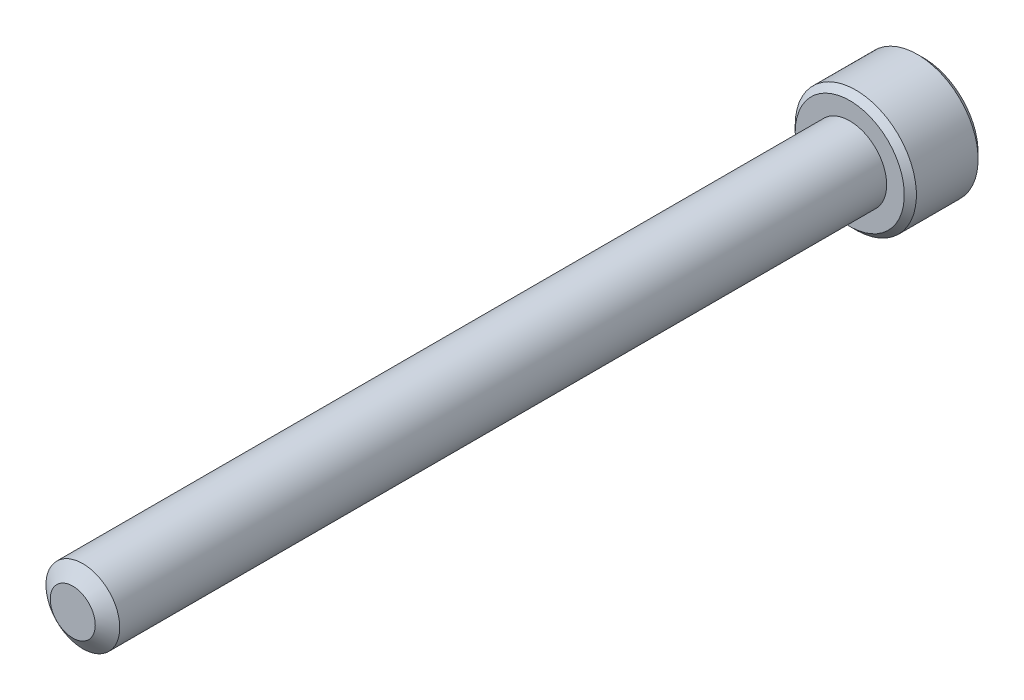
ISO-10303-21;
HEADER;
FILE_DESCRIPTION(('STEP AP214'),'2;1');
FILE_NAME('part.step','',(''),(''),'','','');
FILE_SCHEMA(('AUTOMOTIVE_DESIGN { 1 0 10303 214 1 1 1 1 }'));
ENDSEC;
DATA;
#1=APPLICATION_CONTEXT('core data for automotive mechanical design processes');
#2=APPLICATION_PROTOCOL_DEFINITION('international standard','automotive_design',2000,#1);
#3=PRODUCT_CONTEXT('',#1,'mechanical');
#4=PRODUCT('Part','Part','',(#3));
#5=PRODUCT_RELATED_PRODUCT_CATEGORY('part','',(#4));
#6=PRODUCT_DEFINITION_FORMATION('','',#4);
#7=PRODUCT_DEFINITION_CONTEXT('part definition',#1,'design');
#8=PRODUCT_DEFINITION('design','',#6,#7);
#9=PRODUCT_DEFINITION_SHAPE('','',#8);
#10=(LENGTH_UNIT() NAMED_UNIT(*) SI_UNIT(.MILLI.,.METRE.));
#11=(NAMED_UNIT(*) PLANE_ANGLE_UNIT() SI_UNIT($,.RADIAN.));
#12=(NAMED_UNIT(*) SI_UNIT($,.STERADIAN.) SOLID_ANGLE_UNIT());
#13=UNCERTAINTY_MEASURE_WITH_UNIT(LENGTH_MEASURE(1.E-05),#10,'distance_accuracy_value','');
#14=(GEOMETRIC_REPRESENTATION_CONTEXT(3) GLOBAL_UNCERTAINTY_ASSIGNED_CONTEXT((#13)) GLOBAL_UNIT_ASSIGNED_CONTEXT((#10,
#11,#12)) REPRESENTATION_CONTEXT('',''));
#15=CARTESIAN_POINT('',(0.,0.,0.));
#16=DIRECTION('',(0.,0.,1.));
#17=DIRECTION('',(1.,0.,0.));
#18=AXIS2_PLACEMENT_3D('',#15,#16,#17);
#19=CARTESIAN_POINT('',(0.,0.,-50.8));
#20=DIRECTION('',(0.,0.,1.));
#21=DIRECTION('',(1.,0.,0.));
#22=AXIS2_PLACEMENT_3D('',#19,#20,#21);
#23=CYLINDRICAL_SURFACE('',#22,2.413);
#24=CARTESIAN_POINT('',(0.,0.,-50.8));
#25=DIRECTION('',(0.,0.,-1.));
#26=DIRECTION('',(-1.,0.,0.));
#27=AXIS2_PLACEMENT_3D('',#24,#25,#26);
#28=CIRCLE('',#27,2.413);
#29=CARTESIAN_POINT('',(-2.413,0.,-50.8));
#30=VERTEX_POINT('',#29);
#31=EDGE_CURVE('E216',#30,#30,#28,.F.);
#32=ORIENTED_EDGE('',*,*,#31,.T.);
#33=EDGE_LOOP('',(#32));
#34=FACE_BOUND('',#33,.T.);
#35=CARTESIAN_POINT('',(0.,0.,-0.659180743038974));
#36=DIRECTION('',(0.,0.,1.));
#37=DIRECTION('',(1.,0.,0.));
#38=AXIS2_PLACEMENT_3D('',#35,#36,#37);
#39=CIRCLE('',#38,2.413);
#40=CARTESIAN_POINT('',(2.413,0.,-0.659180743038974));
#41=VERTEX_POINT('',#40);
#42=EDGE_CURVE('E110',#41,#41,#39,.T.);
#43=ORIENTED_EDGE('',*,*,#42,.F.);
#44=EDGE_LOOP('',(#43));
#45=FACE_BOUND('',#44,.T.);
#46=ADVANCED_FACE('F36',(#34,#45),#23,.T.);
#47=CARTESIAN_POINT('',(0.,0.,0.));
#48=DIRECTION('',(0.,0.,-1.));
#49=DIRECTION('',(-1.,0.,0.));
#50=AXIS2_PLACEMENT_3D('',#47,#48,#49);
#51=CONICAL_SURFACE('',#50,1.4715923357461,0.959931088596884);
#52=ORIENTED_EDGE('',*,*,#42,.T.);
#53=EDGE_LOOP('',(#52));
#54=FACE_BOUND('',#53,.T.);
#55=CARTESIAN_POINT('',(0.,0.,0.));
#56=DIRECTION('',(0.,0.,1.));
#57=DIRECTION('',(1.,0.,0.));
#58=AXIS2_PLACEMENT_3D('',#55,#56,#57);
#59=CIRCLE('',#58,1.4715923357461);
#60=CARTESIAN_POINT('',(1.4715923357461,0.,0.));
#61=VERTEX_POINT('',#60);
#62=EDGE_CURVE('E214',#61,#61,#59,.T.);
#63=ORIENTED_EDGE('',*,*,#62,.F.);
#64=EDGE_LOOP('',(#63));
#65=FACE_BOUND('',#64,.T.);
#66=ADVANCED_FACE('F197',(#54,#65),#51,.T.);
#67=CARTESIAN_POINT('',(0.,0.,0.));
#68=DIRECTION('',(0.,0.,1.));
#69=DIRECTION('',(1.,0.,0.));
#70=AXIS2_PLACEMENT_3D('',#67,#68,#69);
#71=PLANE('',#70);
#72=ORIENTED_EDGE('',*,*,#62,.T.);
#73=EDGE_LOOP('',(#72));
#74=FACE_BOUND('',#73,.T.);
#75=ADVANCED_FACE('F194',(#74),#71,.T.);
#76=CARTESIAN_POINT('',(0.,0.,-55.626));
#77=DIRECTION('',(0.,0.,1.));
#78=DIRECTION('',(1.,0.,0.));
#79=AXIS2_PLACEMENT_3D('',#76,#77,#78);
#80=CYLINDRICAL_SURFACE('',#79,3.9624);
#81=CARTESIAN_POINT('',(0.,0.,-55.22976));
#82=DIRECTION('',(0.,0.,-1.));
#83=DIRECTION('',(-1.,0.,0.));
#84=AXIS2_PLACEMENT_3D('',#81,#82,#83);
#85=CIRCLE('',#84,3.9624);
#86=CARTESIAN_POINT('',(-3.9624,0.,-55.22976));
#87=VERTEX_POINT('',#86);
#88=EDGE_CURVE('E44',#87,#87,#85,.F.);
#89=ORIENTED_EDGE('',*,*,#88,.T.);
#90=EDGE_LOOP('',(#89));
#91=FACE_BOUND('',#90,.T.);
#92=CARTESIAN_POINT('',(0.,0.,-51.19624));
#93=DIRECTION('',(0.,0.,-1.));
#94=DIRECTION('',(-1.,0.,0.));
#95=AXIS2_PLACEMENT_3D('',#92,#93,#94);
#96=CIRCLE('',#95,3.9624);
#97=CARTESIAN_POINT('',(-3.9624,0.,-51.19624));
#98=VERTEX_POINT('',#97);
#99=EDGE_CURVE('E173',#98,#98,#96,.T.);
#100=ORIENTED_EDGE('',*,*,#99,.T.);
#101=EDGE_LOOP('',(#100));
#102=FACE_BOUND('',#101,.T.);
#103=ADVANCED_FACE('F178',(#91,#102),#80,.T.);
#104=CARTESIAN_POINT('',(0.,0.,-55.626));
#105=DIRECTION('',(0.,0.,-1.));
#106=DIRECTION('',(-1.,0.,0.));
#107=AXIS2_PLACEMENT_3D('',#104,#105,#106);
#108=PLANE('',#107);
#109=CARTESIAN_POINT('',(0.,0.,-55.626));
#110=DIRECTION('',(0.,0.,-1.));
#111=DIRECTION('',(-1.,0.,0.));
#112=AXIS2_PLACEMENT_3D('',#109,#110,#111);
#113=CIRCLE('',#112,3.56616);
#114=CARTESIAN_POINT('',(-3.56616,0.,-55.626));
#115=VERTEX_POINT('',#114);
#116=EDGE_CURVE('E109',#115,#115,#113,.T.);
#117=ORIENTED_EDGE('',*,*,#116,.T.);
#118=EDGE_LOOP('',(#117));
#119=FACE_BOUND('',#118,.T.);
#120=CARTESIAN_POINT('',(0.,0.,-55.626));
#121=DIRECTION('',(0.,0.,-1.));
#122=DIRECTION('',(-1.,0.,0.));
#123=AXIS2_PLACEMENT_3D('',#120,#121,#122);
#124=CIRCLE('',#123,2.29135888084633);
#125=CARTESIAN_POINT('',(-1.984375,1.14567944042316,-55.626));
#126=VERTEX_POINT('',#125);
#127=CARTESIAN_POINT('',(0.,2.29135888084633,-55.626));
#128=VERTEX_POINT('',#127);
#129=EDGE_CURVE('E90',#126,#128,#124,.T.);
#130=ORIENTED_EDGE('',*,*,#129,.F.);
#131=CARTESIAN_POINT('',(-1.984375,-1.14567944042316,-55.626));
#132=VERTEX_POINT('',#131);
#133=EDGE_CURVE('E50',#132,#126,#124,.T.);
#134=ORIENTED_EDGE('',*,*,#133,.F.);
#135=CARTESIAN_POINT('',(0.,-2.29135888084633,-55.626));
#136=VERTEX_POINT('',#135);
#137=EDGE_CURVE('E275',#136,#132,#124,.T.);
#138=ORIENTED_EDGE('',*,*,#137,.F.);
#139=CARTESIAN_POINT('',(1.984375,-1.14567944042316,-55.626));
#140=VERTEX_POINT('',#139);
#141=EDGE_CURVE('E57',#140,#136,#124,.T.);
#142=ORIENTED_EDGE('',*,*,#141,.F.);
#143=CARTESIAN_POINT('',(1.984375,1.14567944042316,-55.626));
#144=VERTEX_POINT('',#143);
#145=EDGE_CURVE('E131',#144,#140,#124,.T.);
#146=ORIENTED_EDGE('',*,*,#145,.F.);
#147=EDGE_CURVE('E99',#128,#144,#124,.T.);
#148=ORIENTED_EDGE('',*,*,#147,.F.);
#149=EDGE_LOOP('',(#130,#134,#138,#142,#146,#148));
#150=FACE_BOUND('',#149,.T.);
#151=ADVANCED_FACE('F130',(#119,#150),#108,.T.);
#152=CARTESIAN_POINT('',(0.,0.,-50.8));
#153=DIRECTION('',(0.,0.,-1.));
#154=DIRECTION('',(-1.,0.,0.));
#155=AXIS2_PLACEMENT_3D('',#152,#153,#154);
#156=PLANE('',#155);
#157=CARTESIAN_POINT('',(0.,0.,-50.8));
#158=DIRECTION('',(0.,0.,-1.));
#159=DIRECTION('',(-1.,0.,0.));
#160=AXIS2_PLACEMENT_3D('',#157,#158,#159);
#161=CIRCLE('',#160,3.56616);
#162=CARTESIAN_POINT('',(-3.56616,0.,-50.8));
#163=VERTEX_POINT('',#162);
#164=EDGE_CURVE('E11',#163,#163,#161,.F.);
#165=ORIENTED_EDGE('',*,*,#164,.T.);
#166=EDGE_LOOP('',(#165));
#167=FACE_BOUND('',#166,.T.);
#168=ORIENTED_EDGE('',*,*,#31,.F.);
#169=EDGE_LOOP('',(#168));
#170=FACE_BOUND('',#169,.T.);
#171=ADVANCED_FACE('F187',(#167,#170),#156,.F.);
#172=CARTESIAN_POINT('',(0.,0.,-55.626));
#173=DIRECTION('',(0.,0.,-1.));
#174=DIRECTION('',(-1.,0.,0.));
#175=AXIS2_PLACEMENT_3D('',#172,#173,#174);
#176=CONICAL_SURFACE('',#175,2.29135888084633,0.78539816339745);
#177=ORIENTED_EDGE('',*,*,#147,.T.);
#178=CARTESIAN_POINT('',(-0.000199999999999152,2.29147435090016,-55.6261154787818));
#179=CARTESIAN_POINT('',(0.0680159951668032,2.25208982772757,-55.5867628522639));
#180=CARTESIAN_POINT('',(0.137372685106966,2.21204672412052,-55.5497213104462));
#181=CARTESIAN_POINT('',(0.278798800452186,2.13039431835551,-55.4818988584233));
#182=CARTESIAN_POINT('',(0.350881678736782,2.08877724917394,-55.4511556890917));
#183=CARTESIAN_POINT('',(0.496233397266004,2.00485839535392,-55.3984918888112));
#184=CARTESIAN_POINT('',(0.56946521248694,1.96257798712286,-55.37643887588));
#185=CARTESIAN_POINT('',(0.71754118259471,1.87708628592063,-55.3424614929439));
#186=CARTESIAN_POINT('',(0.792380812753429,1.83387760530244,-55.3305117560917));
#187=CARTESIAN_POINT('',(0.921360414543821,1.75941119748879,-55.3197300990819));
#188=CARTESIAN_POINT('',(0.975333715772448,1.72824969749539,-55.3181338990591));
#189=CARTESIAN_POINT('',(1.08319211851981,1.66597761963484,-55.3208218388653));
#190=CARTESIAN_POINT('',(1.13707718248553,1.63486706344893,-55.3251080403405));
#191=CARTESIAN_POINT('',(1.24433853824861,1.57293969082547,-55.3393168730135));
#192=CARTESIAN_POINT('',(1.29771419276015,1.54212324232506,-55.3492458104523));
#193=CARTESIAN_POINT('',(1.4035425174089,1.48102323060121,-55.3741950842745));
#194=CARTESIAN_POINT('',(1.45599525797111,1.45073962671789,-55.3892150303895));
#195=CARTESIAN_POINT('',(1.59035733896365,1.37316564308797,-55.4338078516357));
#196=CARTESIAN_POINT('',(1.67143335715833,1.32635638215845,-55.4667429959383));
#197=CARTESIAN_POINT('',(1.79064830672984,1.25752759893191,-55.5223424412022));
#198=CARTESIAN_POINT('',(1.829934924386,1.23484545965257,-55.5418775920519));
#199=CARTESIAN_POINT('',(1.90778036186805,1.18990137536713,-55.5827287381194));
#200=CARTESIAN_POINT('',(1.9463396111017,1.16763918244233,-55.6040436395683));
#201=CARTESIAN_POINT('',(1.984575,1.14556397036933,-55.6261154787818));
#202=B_SPLINE_CURVE_WITH_KNOTS('',3,(#178,#179,#180,#181,#182,#183,#184,#185,#186,#187,#188,
#189,#190,#191,#192,#193,#194,#195,#196,#197,#198,#199,#200,#201),.UNSPECIFIED.,.F.,.F.,(4,2,2,
2,2,2,2,2,2,2,2,4),(0.,0.264339630306623,0.530219665093693,0.791876416371462,1.05287424418109,
1.23963984393201,1.42647091743853,1.61351120244035,1.80053715247541,2.09764209964316,
2.24579179873713,2.39385111134157),.UNSPECIFIED.);
#203=EDGE_CURVE('E104',#128,#144,#202,.T.);
#204=ORIENTED_EDGE('',*,*,#203,.F.);
#205=EDGE_LOOP('',(#177,#204));
#206=FACE_BOUND('',#205,.T.);
#207=ADVANCED_FACE('F105',(#206),#176,.F.);
#208=ORIENTED_EDGE('',*,*,#145,.T.);
#209=CARTESIAN_POINT('',(1.984375,-2.28495242157823,-56.3609840788166));
#210=CARTESIAN_POINT('',(1.984375,-2.22931635455402,-56.3189866855508));
#211=CARTESIAN_POINT('',(1.984375,-2.1733687654839,-56.2773960540763));
#212=CARTESIAN_POINT('',(1.984375,-2.06072770258171,-56.1952084614715));
#213=CARTESIAN_POINT('',(1.984375,-2.00403404503435,-56.154611752405));
#214=CARTESIAN_POINT('',(1.984375,-1.88936329173489,-56.0743035031747));
#215=CARTESIAN_POINT('',(1.984375,-1.83137965519348,-56.0346012588133));
#216=CARTESIAN_POINT('',(1.984375,-1.71442802137841,-55.9566851734013));
#217=CARTESIAN_POINT('',(1.984375,-1.65546009407228,-55.9184712271944));
#218=CARTESIAN_POINT('',(1.984375,-1.47005472306036,-55.8022528340136));
#219=CARTESIAN_POINT('',(1.984375,-1.34163909427884,-55.7273478868724));
#220=CARTESIAN_POINT('',(1.984375,-1.0784038470548,-55.5903302154397));
#221=CARTESIAN_POINT('',(1.984375,-0.943607781407426,-55.5281743664824));
#222=CARTESIAN_POINT('',(1.984375,-0.741275100444882,-55.4521325786886));
#223=CARTESIAN_POINT('',(1.984375,-0.676735408881095,-55.430308061326));
#224=CARTESIAN_POINT('',(1.984375,-0.546098118112761,-55.3918404635378));
#225=CARTESIAN_POINT('',(1.984375,-0.480000411919955,-55.3751977400655));
#226=CARTESIAN_POINT('',(1.984375,-0.34774617002853,-55.3482353808697));
#227=CARTESIAN_POINT('',(1.984375,-0.281612071479121,-55.3378074097359));
#228=CARTESIAN_POINT('',(1.984375,-0.148636620052348,-55.3234781473766));
#229=CARTESIAN_POINT('',(1.984375,-0.0817953907393206,-55.3195757342274));
#230=CARTESIAN_POINT('',(1.984375,0.0495156750890684,-55.3185870513327));
#231=CARTESIAN_POINT('',(1.984375,0.113983775102996,-55.321259178875));
#232=CARTESIAN_POINT('',(1.984375,0.242367515846182,-55.3327392104975));
#233=CARTESIAN_POINT('',(1.984375,0.306283102295925,-55.3415477106392));
#234=CARTESIAN_POINT('',(1.984375,0.434181040262189,-55.3649690213329));
#235=CARTESIAN_POINT('',(1.984375,0.498145026858315,-55.3796806062321));
#236=CARTESIAN_POINT('',(1.984375,0.624675616953012,-55.4141261814121));
#237=CARTESIAN_POINT('',(1.984375,0.687242336899693,-55.4338597514492));
#238=CARTESIAN_POINT('',(1.984375,0.884225483826091,-55.5034122372308));
#239=CARTESIAN_POINT('',(1.984375,1.01583674256468,-55.5611524112565));
#240=CARTESIAN_POINT('',(1.984375,1.27288659242652,-55.6895303365888));
#241=CARTESIAN_POINT('',(1.984375,1.3983008827048,-55.7602144249194));
#242=CARTESIAN_POINT('',(1.984375,1.57956687990221,-55.8705166638132));
#243=CARTESIAN_POINT('',(1.984375,1.63738271299424,-55.9069698294754));
#244=CARTESIAN_POINT('',(1.984375,1.75202215386202,-55.9814159632917));
#245=CARTESIAN_POINT('',(1.984375,1.80884568601362,-56.0194090480781));
#246=CARTESIAN_POINT('',(1.984375,1.92116923084256,-56.0963388088931));
#247=CARTESIAN_POINT('',(1.984375,1.97667624512254,-56.1352653130388));
#248=CARTESIAN_POINT('',(1.984375,2.08693170717167,-56.2141477461214));
#249=CARTESIAN_POINT('',(1.984375,2.14168035934793,-56.254103389024));
#250=CARTESIAN_POINT('',(1.984375,2.19611149046623,-56.2944806112854));
#251=B_SPLINE_CURVE_WITH_KNOTS('',3,(#209,#210,#211,#212,#213,#214,#215,#216,#217,#218,#219,
#220,#221,#222,#223,#224,#225,#226,#227,#228,#229,#230,#231,#232,#233,#234,#235,#236,#237,#238,
#239,#240,#241,#242,#243,#244,#245,#246,#247,#248,#249,#250),.UNSPECIFIED.,.F.,.F.,(4,2,2,2,2,2,
2,2,2,2,2,2,2,2,2,2,2,2,2,2,4),(0.,0.20912607000832,0.418304637356568,0.629103979977992,
0.839888401371183,1.28549951116127,1.72957750768351,1.93379389749972,2.13802435186699,
2.33858179514334,2.5391047535064,2.73236963400795,2.92565329006888,3.12231577097488,
3.31896180041346,3.74886295245173,4.18033428125363,4.38536017180291,4.59040161996384,
4.79377749165109,4.99709743524133),.UNSPECIFIED.);
#252=EDGE_CURVE('E98',#144,#140,#251,.F.);
#253=ORIENTED_EDGE('',*,*,#252,.F.);
#254=EDGE_LOOP('',(#208,#253));
#255=FACE_BOUND('',#254,.T.);
#256=ADVANCED_FACE('F281',(#255),#176,.F.);
#257=ORIENTED_EDGE('',*,*,#141,.T.);
#258=CARTESIAN_POINT('',(1.984575,-1.14556397036933,-55.6261154787818));
#259=CARTESIAN_POINT('',(1.9163590048332,-1.18494849354192,-55.5867628522639));
#260=CARTESIAN_POINT('',(1.84700231489303,-1.22499159714897,-55.5497213104462));
#261=CARTESIAN_POINT('',(1.70557619954781,-1.30664400291398,-55.4818988584233));
#262=CARTESIAN_POINT('',(1.63349332126322,-1.34826107209555,-55.4511556890917));
#263=CARTESIAN_POINT('',(1.488141602734,-1.43217992591557,-55.3984918888112));
#264=CARTESIAN_POINT('',(1.41490978751306,-1.47446033414663,-55.37643887588));
#265=CARTESIAN_POINT('',(1.26683381740529,-1.55995203534886,-55.3424614929439));
#266=CARTESIAN_POINT('',(1.19199418724657,-1.60316071596705,-55.3305117560917));
#267=CARTESIAN_POINT('',(1.06301458545618,-1.6776271237807,-55.3197300990819));
#268=CARTESIAN_POINT('',(1.00904128422755,-1.7087886237741,-55.3181338990591));
#269=CARTESIAN_POINT('',(0.901182881480194,-1.77106070163465,-55.3208218388653));
#270=CARTESIAN_POINT('',(0.847297817514471,-1.80217125782057,-55.3251080403405));
#271=CARTESIAN_POINT('',(0.74003646175139,-1.86409863044402,-55.3393168730135));
#272=CARTESIAN_POINT('',(0.686660807239854,-1.89491507894443,-55.3492458104523));
#273=CARTESIAN_POINT('',(0.580832482591098,-1.95601509066828,-55.3741950842745));
#274=CARTESIAN_POINT('',(0.528379742028893,-1.9862986945516,-55.3892150303895));
#275=CARTESIAN_POINT('',(0.394017661036348,-2.06387267818152,-55.4338078516357));
#276=CARTESIAN_POINT('',(0.312941642841674,-2.11068193911104,-55.4667429959383));
#277=CARTESIAN_POINT('',(0.193726693270163,-2.17951072233758,-55.5223424412022));
#278=CARTESIAN_POINT('',(0.154440075614003,-2.20219286161692,-55.5418775920519));
#279=CARTESIAN_POINT('',(0.0765946381319523,-2.24713694590236,-55.5827287381194));
#280=CARTESIAN_POINT('',(0.0380353888983053,-2.26939913882716,-55.6040436395683));
#281=CARTESIAN_POINT('',(-0.000199999999998087,-2.29147435090016,-55.6261154787818));
#282=B_SPLINE_CURVE_WITH_KNOTS('',3,(#258,#259,#260,#261,#262,#263,#264,#265,#266,#267,#268,
#269,#270,#271,#272,#273,#274,#275,#276,#277,#278,#279,#280,#281),.UNSPECIFIED.,.F.,.F.,(4,2,2,
2,2,2,2,2,2,2,2,4),(0.,0.264339630306623,0.530219665093693,0.791876416371462,1.05287424418109,
1.23963984393201,1.42647091743853,1.61351120244035,1.80053715247541,2.09764209964316,
2.24579179873713,2.39385111134157),.UNSPECIFIED.);
#283=EDGE_CURVE('E141',#140,#136,#282,.T.);
#284=ORIENTED_EDGE('',*,*,#283,.F.);
#285=EDGE_LOOP('',(#257,#284));
#286=FACE_BOUND('',#285,.T.);
#287=ADVANCED_FACE('F278',(#286),#176,.F.);
#288=ORIENTED_EDGE('',*,*,#137,.T.);
#289=CARTESIAN_POINT('',(0.000200000000000443,-2.29147435090016,-55.6261154787818));
#290=CARTESIAN_POINT('',(-0.0680159951668036,-2.25208982772757,-55.5867628522639));
#291=CARTESIAN_POINT('',(-0.137372685106967,-2.21204672412052,-55.5497213104462));
#292=CARTESIAN_POINT('',(-0.278798800452188,-2.13039431835551,-55.4818988584233));
#293=CARTESIAN_POINT('',(-0.350881678736782,-2.08877724917394,-55.4511556890917));
#294=CARTESIAN_POINT('',(-0.496233397266002,-2.00485839535392,-55.3984918888112));
#295=CARTESIAN_POINT('',(-0.569465212486938,-1.96257798712287,-55.37643887588));
#296=CARTESIAN_POINT('',(-0.717541182594707,-1.87708628592063,-55.3424614929439));
#297=CARTESIAN_POINT('',(-0.792380812753427,-1.83387760530244,-55.3305117560917));
#298=CARTESIAN_POINT('',(-0.921360414543819,-1.75941119748879,-55.3197300990819));
#299=CARTESIAN_POINT('',(-0.975333715772446,-1.72824969749539,-55.3181338990591));
#300=CARTESIAN_POINT('',(-1.0831921185198,-1.66597761963484,-55.3208218388653));
#301=CARTESIAN_POINT('',(-1.13707718248553,-1.63486706344893,-55.3251080403405));
#302=CARTESIAN_POINT('',(-1.24433853824861,-1.57293969082547,-55.3393168730135));
#303=CARTESIAN_POINT('',(-1.29771419276014,-1.54212324232506,-55.3492458104523));
#304=CARTESIAN_POINT('',(-1.4035425174089,-1.48102323060121,-55.3741950842745));
#305=CARTESIAN_POINT('',(-1.4559952579711,-1.45073962671789,-55.3892150303895));
#306=CARTESIAN_POINT('',(-1.59035733896365,-1.37316564308797,-55.4338078516357));
#307=CARTESIAN_POINT('',(-1.67143335715833,-1.32635638215845,-55.4667429959383));
#308=CARTESIAN_POINT('',(-1.79064830672984,-1.25752759893191,-55.5223424412022));
#309=CARTESIAN_POINT('',(-1.829934924386,-1.23484545965257,-55.5418775920519));
#310=CARTESIAN_POINT('',(-1.90778036186805,-1.18990137536713,-55.5827287381194));
#311=CARTESIAN_POINT('',(-1.9463396111017,-1.16763918244233,-55.6040436395683));
#312=CARTESIAN_POINT('',(-1.984575,-1.14556397036933,-55.6261154787818));
#313=B_SPLINE_CURVE_WITH_KNOTS('',3,(#289,#290,#291,#292,#293,#294,#295,#296,#297,#298,#299,
#300,#301,#302,#303,#304,#305,#306,#307,#308,#309,#310,#311,#312),.UNSPECIFIED.,.F.,.F.,(4,2,2,
2,2,2,2,2,2,2,2,4),(0.,0.264339630306627,0.530219665093692,0.79187641637146,1.05287424418109,
1.239639843932,1.42647091743853,1.61351120244035,1.80053715247541,2.09764209964316,
2.24579179873713,2.39385111134157),.UNSPECIFIED.);
#314=EDGE_CURVE('E252',#136,#132,#313,.T.);
#315=ORIENTED_EDGE('',*,*,#314,.F.);
#316=EDGE_LOOP('',(#288,#315));
#317=FACE_BOUND('',#316,.T.);
#318=ADVANCED_FACE('F277',(#317),#176,.F.);
#319=ORIENTED_EDGE('',*,*,#133,.T.);
#320=CARTESIAN_POINT('',(-1.984375,-2.28495242191067,-56.3609840790676));
#321=CARTESIAN_POINT('',(-1.984375,-2.22931635487714,-56.3189866857921));
#322=CARTESIAN_POINT('',(-1.984375,-2.17336876579766,-56.277396054308));
#323=CARTESIAN_POINT('',(-1.984375,-2.06072770287667,-56.1952084616839));
#324=CARTESIAN_POINT('',(-1.984375,-2.00403404531985,-56.1546117526079));
#325=CARTESIAN_POINT('',(-1.984375,-1.88936329200117,-56.0743035033582));
#326=CARTESIAN_POINT('',(-1.984375,-1.83137965544999,-56.0346012589872));
#327=CARTESIAN_POINT('',(-1.984375,-1.71442802161519,-55.956685173556));
#328=CARTESIAN_POINT('',(-1.984375,-1.65546009429911,-55.9184712273396));
#329=CARTESIAN_POINT('',(-1.984375,-1.47005472325436,-55.8022528341287));
#330=CARTESIAN_POINT('',(-1.984375,-1.34163909444949,-55.7273478869673));
#331=CARTESIAN_POINT('',(-1.984375,-1.07840384717678,-55.5903302154972));
#332=CARTESIAN_POINT('',(-1.984375,-0.943607781504097,-55.5281743665226));
#333=CARTESIAN_POINT('',(-1.984375,-0.741275100522508,-55.452132578716));
#334=CARTESIAN_POINT('',(-1.984375,-0.676735408966696,-55.4303080613539));
#335=CARTESIAN_POINT('',(-1.984375,-0.546098118214574,-55.3918404635651));
#336=CARTESIAN_POINT('',(-1.984375,-0.480000412030006,-55.3751977400917));
#337=CARTESIAN_POINT('',(-1.984375,-0.347746170154783,-55.3482353808918));
#338=CARTESIAN_POINT('',(-1.984375,-0.281612071613335,-55.337807409755));
#339=CARTESIAN_POINT('',(-1.984375,-0.148636620202217,-55.3234781473881));
#340=CARTESIAN_POINT('',(-1.984375,-0.0817953908968854,-55.3195757342341));
#341=CARTESIAN_POINT('',(-1.984375,0.0495156749173055,-55.3185870513286));
#342=CARTESIAN_POINT('',(-1.984375,0.11398377492471,-55.321259178865));
#343=CARTESIAN_POINT('',(-1.984375,0.242367515655504,-55.3327392104746));
#344=CARTESIAN_POINT('',(-1.984375,0.306283102099377,-55.3415477106093));
#345=CARTESIAN_POINT('',(-1.984375,0.434181040054054,-55.3649690212885));
#346=CARTESIAN_POINT('',(-1.984375,0.49814502664448,-55.3796806061801));
#347=CARTESIAN_POINT('',(-1.984375,0.624675616728327,-55.4141261813447));
#348=CARTESIAN_POINT('',(-1.984375,0.687242336669859,-55.433859751374));
#349=CARTESIAN_POINT('',(-1.984375,0.884225483546215,-55.5034122371188));
#350=CARTESIAN_POINT('',(-1.984375,1.01583674224242,-55.5611524111108));
#351=CARTESIAN_POINT('',(-1.984375,1.27288659202274,-55.6895303363718));
#352=CARTESIAN_POINT('',(-1.984375,1.39830088226191,-55.7602144246649));
#353=CARTESIAN_POINT('',(-1.984375,1.57956687940504,-55.8705166635036));
#354=CARTESIAN_POINT('',(-1.984375,1.63738271248118,-55.9069698291489));
#355=CARTESIAN_POINT('',(-1.984375,1.75202215331742,-55.9814159629313));
#356=CARTESIAN_POINT('',(-1.984375,1.80884568545336,-56.0194090477007));
#357=CARTESIAN_POINT('',(-1.984375,1.92116923025137,-56.0963388084819));
#358=CARTESIAN_POINT('',(-1.984375,1.97667624451607,-56.1352653126108));
#359=CARTESIAN_POINT('',(-1.984375,2.08693170653473,-56.2141477456598));
#360=CARTESIAN_POINT('',(-1.984375,2.14168035869581,-56.2541033885457));
#361=CARTESIAN_POINT('',(-1.984375,2.19611148979895,-56.2944806107903));
#362=B_SPLINE_CURVE_WITH_KNOTS('',3,(#320,#321,#322,#323,#324,#325,#326,#327,#328,#329,#330,
#331,#332,#333,#334,#335,#336,#337,#338,#339,#340,#341,#342,#343,#344,#345,#346,#347,#348,#349,
#350,#351,#352,#353,#354,#355,#356,#357,#358,#359,#360,#361),.UNSPECIFIED.,.F.,.F.,(4,2,2,2,2,2,
2,2,2,2,2,2,2,2,2,2,2,2,2,2,4),(0.,0.209126070048126,0.418304637436191,0.629103980098173,
0.839888401531926,1.28549951141299,1.72957750802534,1.93379389781848,2.13802435216272,
2.33858179541699,2.53910475375796,2.7323696342393,2.92565329027999,3.12231577116423,
3.31896180058103,3.74886295246282,4.1803342811072,4.38536017158909,4.59040161968263,
4.79377749130341,4.99709743482718),.UNSPECIFIED.);
#363=EDGE_CURVE('E120',#132,#126,#362,.T.);
#364=ORIENTED_EDGE('',*,*,#363,.F.);
#365=EDGE_LOOP('',(#319,#364));
#366=FACE_BOUND('',#365,.T.);
#367=ADVANCED_FACE('F290',(#366),#176,.F.);
#368=ORIENTED_EDGE('',*,*,#129,.T.);
#369=CARTESIAN_POINT('',(-1.984575,1.14556397036933,-55.6261154787818));
#370=CARTESIAN_POINT('',(-1.9163590048332,1.18494849354192,-55.5867628522639));
#371=CARTESIAN_POINT('',(-1.84700231489303,1.22499159714897,-55.5497213104462));
#372=CARTESIAN_POINT('',(-1.70557619954781,1.30664400291398,-55.4818988584233));
#373=CARTESIAN_POINT('',(-1.63349332126321,1.34826107209555,-55.4511556890917));
#374=CARTESIAN_POINT('',(-1.48814160273399,1.43217992591558,-55.3984918888112));
#375=CARTESIAN_POINT('',(-1.41490978751306,1.47446033414663,-55.37643887588));
#376=CARTESIAN_POINT('',(-1.26683381740529,1.55995203534886,-55.3424614929439));
#377=CARTESIAN_POINT('',(-1.19199418724657,1.60316071596705,-55.3305117560917));
#378=CARTESIAN_POINT('',(-1.06301458545618,1.6776271237807,-55.3197300990819));
#379=CARTESIAN_POINT('',(-1.00904128422755,1.7087886237741,-55.3181338990591));
#380=CARTESIAN_POINT('',(-0.901182881480195,1.77106070163465,-55.3208218388653));
#381=CARTESIAN_POINT('',(-0.847297817514472,1.80217125782056,-55.3251080403405));
#382=CARTESIAN_POINT('',(-0.740036461751391,1.86409863044402,-55.3393168730135));
#383=CARTESIAN_POINT('',(-0.686660807239855,1.89491507894443,-55.3492458104523));
#384=CARTESIAN_POINT('',(-0.580832482591099,1.95601509066828,-55.3741950842745));
#385=CARTESIAN_POINT('',(-0.528379742028894,1.9862986945516,-55.3892150303895));
#386=CARTESIAN_POINT('',(-0.394017661036348,2.06387267818152,-55.4338078516357));
#387=CARTESIAN_POINT('',(-0.312941642841674,2.11068193911104,-55.4667429959383));
#388=CARTESIAN_POINT('',(-0.193726693270161,2.17951072233758,-55.5223424412022));
#389=CARTESIAN_POINT('',(-0.154440075613999,2.20219286161692,-55.5418775920519));
#390=CARTESIAN_POINT('',(-0.0765946381319473,2.24713694590236,-55.5827287381194));
#391=CARTESIAN_POINT('',(-0.0380353888983017,2.26939913882716,-55.6040436395683));
#392=CARTESIAN_POINT('',(0.000199999999999549,2.29147435090016,-55.6261154787818));
#393=B_SPLINE_CURVE_WITH_KNOTS('',3,(#369,#370,#371,#372,#373,#374,#375,#376,#377,#378,#379,
#380,#381,#382,#383,#384,#385,#386,#387,#388,#389,#390,#391,#392),.UNSPECIFIED.,.F.,.F.,(4,2,2,
2,2,2,2,2,2,2,2,4),(0.,0.26433963030663,0.530219665093698,0.791876416371464,1.0528742441811,
1.23963984393201,1.42647091743853,1.61351120244035,1.80053715247541,2.09764209964316,
2.24579179873714,2.39385111134157),.UNSPECIFIED.);
#394=EDGE_CURVE('E94',#126,#128,#393,.T.);
#395=ORIENTED_EDGE('',*,*,#394,.F.);
#396=EDGE_LOOP('',(#368,#395));
#397=FACE_BOUND('',#396,.T.);
#398=ADVANCED_FACE('F92',(#397),#176,.F.);
#399=CARTESIAN_POINT('',(1.984375,3.43703832126949,-52.6494375));
#400=DIRECTION('',(0.,0.,-1.));
#401=DIRECTION('',(-1.,0.,0.));
#402=AXIS2_PLACEMENT_3D('',#399,#400,#401);
#403=PLANE('',#402);
#404=DIRECTION('',(0.866025403784439,0.5,0.));
#405=VECTOR('',#404,1.);
#406=CARTESIAN_POINT('',(-1.984375,1.14567944042316,-52.6494375));
#407=LINE('',#406,#405);
#408=CARTESIAN_POINT('',(-1.984375,1.14567944042316,-52.6494375));
#409=VERTEX_POINT('',#408);
#410=CARTESIAN_POINT('',(0.,2.29135888084633,-52.6494375));
#411=VERTEX_POINT('',#410);
#412=EDGE_CURVE('E119',#409,#411,#407,.T.);
#413=ORIENTED_EDGE('',*,*,#412,.T.);
#414=DIRECTION('',(0.866025403784439,-0.5,0.));
#415=VECTOR('',#414,1.);
#416=CARTESIAN_POINT('',(0.,2.29135888084633,-52.6494375));
#417=LINE('',#416,#415);
#418=CARTESIAN_POINT('',(1.984375,1.14567944042316,-52.6494375));
#419=VERTEX_POINT('',#418);
#420=EDGE_CURVE('E124',#411,#419,#417,.T.);
#421=ORIENTED_EDGE('',*,*,#420,.T.);
#422=DIRECTION('',(0.,-1.,0.));
#423=VECTOR('',#422,1.);
#424=CARTESIAN_POINT('',(1.984375,1.14567944042316,-52.6494375));
#425=LINE('',#424,#423);
#426=CARTESIAN_POINT('',(1.984375,-1.14567944042316,-52.6494375));
#427=VERTEX_POINT('',#426);
#428=EDGE_CURVE('E238',#419,#427,#425,.T.);
#429=ORIENTED_EDGE('',*,*,#428,.T.);
#430=DIRECTION('',(-0.866025403784439,-0.5,0.));
#431=VECTOR('',#430,1.);
#432=CARTESIAN_POINT('',(1.984375,-1.14567944042316,-52.6494375));
#433=LINE('',#432,#431);
#434=CARTESIAN_POINT('',(0.,-2.29135888084633,-52.6494375));
#435=VERTEX_POINT('',#434);
#436=EDGE_CURVE('E235',#427,#435,#433,.T.);
#437=ORIENTED_EDGE('',*,*,#436,.T.);
#438=DIRECTION('',(-0.866025403784439,0.5,0.));
#439=VECTOR('',#438,1.);
#440=CARTESIAN_POINT('',(0.,-2.29135888084633,-52.6494375));
#441=LINE('',#440,#439);
#442=CARTESIAN_POINT('',(-1.984375,-1.14567944042316,-52.6494375));
#443=VERTEX_POINT('',#442);
#444=EDGE_CURVE('E232',#435,#443,#441,.T.);
#445=ORIENTED_EDGE('',*,*,#444,.T.);
#446=DIRECTION('',(0.,1.,0.));
#447=VECTOR('',#446,1.);
#448=CARTESIAN_POINT('',(-1.984375,-1.14567944042316,-52.6494375));
#449=LINE('',#448,#447);
#450=EDGE_CURVE('E127',#443,#409,#449,.T.);
#451=ORIENTED_EDGE('',*,*,#450,.T.);
#452=EDGE_LOOP('',(#413,#421,#429,#437,#445,#451));
#453=FACE_BOUND('',#452,.T.);
#454=ADVANCED_FACE('F161',(#453),#403,.T.);
#455=CARTESIAN_POINT('',(0.,2.29135888084633,-52.6494375));
#456=DIRECTION('',(0.5,0.866025403784439,0.));
#457=DIRECTION('',(-0.866025403784439,0.5,0.));
#458=AXIS2_PLACEMENT_3D('',#455,#456,#457);
#459=PLANE('',#458);
#460=DIRECTION('',(0.,0.,-1.));
#461=VECTOR('',#460,1.);
#462=CARTESIAN_POINT('',(0.,2.29135888084633,-52.6494375));
#463=LINE('',#462,#461);
#464=EDGE_CURVE('E116',#411,#128,#463,.T.);
#465=ORIENTED_EDGE('',*,*,#464,.T.);
#466=ORIENTED_EDGE('',*,*,#203,.T.);
#467=DIRECTION('',(0.,0.,-1.));
#468=VECTOR('',#467,1.);
#469=CARTESIAN_POINT('',(1.984375,1.14567944042316,-52.6494375));
#470=LINE('',#469,#468);
#471=EDGE_CURVE('E126',#419,#144,#470,.T.);
#472=ORIENTED_EDGE('',*,*,#471,.F.);
#473=ORIENTED_EDGE('',*,*,#420,.F.);
#474=EDGE_LOOP('',(#465,#466,#472,#473));
#475=FACE_BOUND('',#474,.T.);
#476=ADVANCED_FACE('F122',(#475),#459,.F.);
#477=CARTESIAN_POINT('',(1.984375,1.14567944042316,-52.6494375));
#478=DIRECTION('',(1.,0.,0.));
#479=DIRECTION('',(0.,0.,-1.));
#480=AXIS2_PLACEMENT_3D('',#477,#478,#479);
#481=PLANE('',#480);
#482=ORIENTED_EDGE('',*,*,#471,.T.);
#483=ORIENTED_EDGE('',*,*,#252,.T.);
#484=DIRECTION('',(0.,0.,-1.));
#485=VECTOR('',#484,1.);
#486=CARTESIAN_POINT('',(1.984375,-1.14567944042316,-52.6494375));
#487=LINE('',#486,#485);
#488=EDGE_CURVE('E221',#427,#140,#487,.T.);
#489=ORIENTED_EDGE('',*,*,#488,.F.);
#490=ORIENTED_EDGE('',*,*,#428,.F.);
#491=EDGE_LOOP('',(#482,#483,#489,#490));
#492=FACE_BOUND('',#491,.T.);
#493=ADVANCED_FACE('F150',(#492),#481,.F.);
#494=CARTESIAN_POINT('',(1.984375,-1.14567944042316,-52.6494375));
#495=DIRECTION('',(0.5,-0.866025403784439,0.));
#496=DIRECTION('',(0.866025403784439,0.5,0.));
#497=AXIS2_PLACEMENT_3D('',#494,#495,#496);
#498=PLANE('',#497);
#499=ORIENTED_EDGE('',*,*,#488,.T.);
#500=ORIENTED_EDGE('',*,*,#283,.T.);
#501=DIRECTION('',(0.,0.,-1.));
#502=VECTOR('',#501,1.);
#503=CARTESIAN_POINT('',(0.,-2.29135888084633,-52.6494375));
#504=LINE('',#503,#502);
#505=EDGE_CURVE('E224',#435,#136,#504,.T.);
#506=ORIENTED_EDGE('',*,*,#505,.F.);
#507=ORIENTED_EDGE('',*,*,#436,.F.);
#508=EDGE_LOOP('',(#499,#500,#506,#507));
#509=FACE_BOUND('',#508,.T.);
#510=ADVANCED_FACE('F154',(#509),#498,.F.);
#511=CARTESIAN_POINT('',(0.,-2.29135888084633,-52.6494375));
#512=DIRECTION('',(-0.5,-0.866025403784439,0.));
#513=DIRECTION('',(0.866025403784439,-0.5,0.));
#514=AXIS2_PLACEMENT_3D('',#511,#512,#513);
#515=PLANE('',#514);
#516=ORIENTED_EDGE('',*,*,#505,.T.);
#517=ORIENTED_EDGE('',*,*,#314,.T.);
#518=DIRECTION('',(0.,0.,-1.));
#519=VECTOR('',#518,1.);
#520=CARTESIAN_POINT('',(-1.984375,-1.14567944042316,-52.6494375));
#521=LINE('',#520,#519);
#522=EDGE_CURVE('E227',#443,#132,#521,.T.);
#523=ORIENTED_EDGE('',*,*,#522,.F.);
#524=ORIENTED_EDGE('',*,*,#444,.F.);
#525=EDGE_LOOP('',(#516,#517,#523,#524));
#526=FACE_BOUND('',#525,.T.);
#527=ADVANCED_FACE('F260',(#526),#515,.F.);
#528=CARTESIAN_POINT('',(-1.984375,-1.14567944042316,-52.6494375));
#529=DIRECTION('',(-1.,0.,0.));
#530=DIRECTION('',(0.,-1.,0.));
#531=AXIS2_PLACEMENT_3D('',#528,#529,#530);
#532=PLANE('',#531);
#533=ORIENTED_EDGE('',*,*,#522,.T.);
#534=ORIENTED_EDGE('',*,*,#363,.T.);
#535=DIRECTION('',(0.,0.,-1.));
#536=VECTOR('',#535,1.);
#537=CARTESIAN_POINT('',(-1.984375,1.14567944042316,-52.6494375));
#538=LINE('',#537,#536);
#539=EDGE_CURVE('E118',#409,#126,#538,.T.);
#540=ORIENTED_EDGE('',*,*,#539,.F.);
#541=ORIENTED_EDGE('',*,*,#450,.F.);
#542=EDGE_LOOP('',(#533,#534,#540,#541));
#543=FACE_BOUND('',#542,.T.);
#544=ADVANCED_FACE('F257',(#543),#532,.F.);
#545=CARTESIAN_POINT('',(-1.984375,1.14567944042316,-52.6494375));
#546=DIRECTION('',(-0.5,0.866025403784439,0.));
#547=DIRECTION('',(-0.866025403784439,-0.5,0.));
#548=AXIS2_PLACEMENT_3D('',#545,#546,#547);
#549=PLANE('',#548);
#550=ORIENTED_EDGE('',*,*,#539,.T.);
#551=ORIENTED_EDGE('',*,*,#394,.T.);
#552=ORIENTED_EDGE('',*,*,#464,.F.);
#553=ORIENTED_EDGE('',*,*,#412,.F.);
#554=EDGE_LOOP('',(#550,#551,#552,#553));
#555=FACE_BOUND('',#554,.T.);
#556=ADVANCED_FACE('F114',(#555),#549,.F.);
#557=CARTESIAN_POINT('',(0.,0.,-55.626));
#558=DIRECTION('',(0.,0.,1.));
#559=DIRECTION('',(1.,0.,0.));
#560=AXIS2_PLACEMENT_3D('',#557,#558,#559);
#561=CONICAL_SURFACE('',#560,3.56616,0.78539816339745);
#562=ORIENTED_EDGE('',*,*,#88,.F.);
#563=EDGE_LOOP('',(#562));
#564=FACE_BOUND('',#563,.T.);
#565=ORIENTED_EDGE('',*,*,#116,.F.);
#566=EDGE_LOOP('',(#565));
#567=FACE_BOUND('',#566,.T.);
#568=ADVANCED_FACE('F181',(#564,#567),#561,.T.);
#569=CARTESIAN_POINT('',(0.,0.,-51.19624));
#570=DIRECTION('',(0.,0.,-1.));
#571=DIRECTION('',(-1.,0.,0.));
#572=AXIS2_PLACEMENT_3D('',#569,#570,#571);
#573=CONICAL_SURFACE('',#572,3.9624,0.78539816339745);
#574=ORIENTED_EDGE('',*,*,#164,.F.);
#575=EDGE_LOOP('',(#574));
#576=FACE_BOUND('',#575,.T.);
#577=ORIENTED_EDGE('',*,*,#99,.F.);
#578=EDGE_LOOP('',(#577));
#579=FACE_BOUND('',#578,.T.);
#580=ADVANCED_FACE('F38',(#576,#579),#573,.T.);
#581=CLOSED_SHELL('',(#46,#66,#75,#103,#151,#171,#207,#256,#287,#318,#367,#398,#454,#476,#493,
#510,#527,#544,#556,#568,#580));
#582=MANIFOLD_SOLID_BREP('B2',#581);
#583=ADVANCED_BREP_SHAPE_REPRESENTATION('',(#18,#582),#14);
#584=SHAPE_DEFINITION_REPRESENTATION(#9,#583);
ENDSEC;
END-ISO-10303-21;
